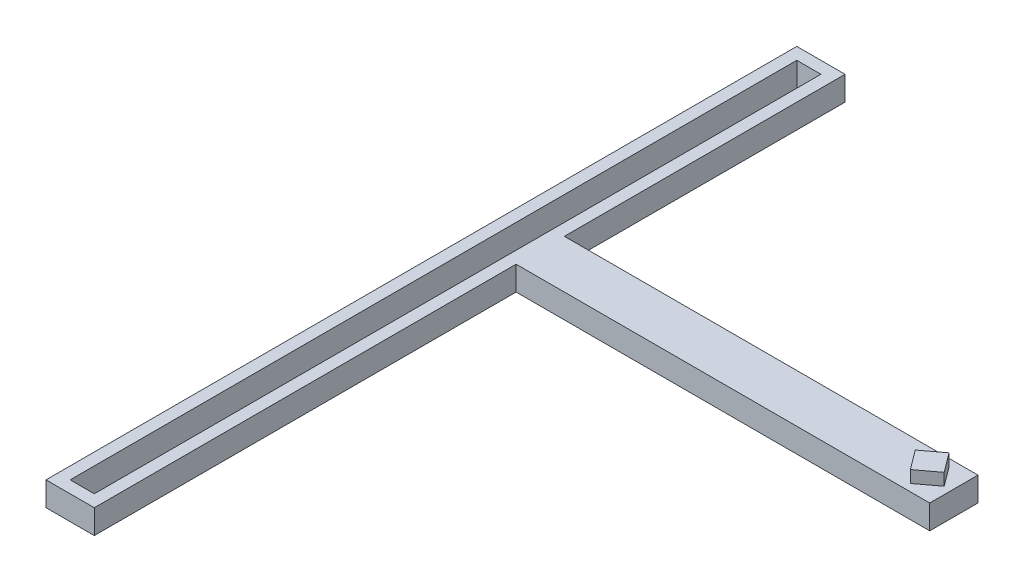
ISO-10303-21;
HEADER;
FILE_DESCRIPTION(('STEP AP214'),'2;1');
FILE_NAME('part.step','',(''),(''),'','','');
FILE_SCHEMA(('AUTOMOTIVE_DESIGN { 1 0 10303 214 1 1 1 1 }'));
ENDSEC;
DATA;
#1=APPLICATION_CONTEXT('core data for automotive mechanical design processes');
#2=APPLICATION_PROTOCOL_DEFINITION('international standard','automotive_design',2000,#1);
#3=PRODUCT_CONTEXT('',#1,'mechanical');
#4=PRODUCT('Part','Part','',(#3));
#5=PRODUCT_RELATED_PRODUCT_CATEGORY('part','',(#4));
#6=PRODUCT_DEFINITION_FORMATION('','',#4);
#7=PRODUCT_DEFINITION_CONTEXT('part definition',#1,'design');
#8=PRODUCT_DEFINITION('design','',#6,#7);
#9=PRODUCT_DEFINITION_SHAPE('','',#8);
#10=(LENGTH_UNIT() NAMED_UNIT(*) SI_UNIT(.MILLI.,.METRE.));
#11=(NAMED_UNIT(*) PLANE_ANGLE_UNIT() SI_UNIT($,.RADIAN.));
#12=(NAMED_UNIT(*) SI_UNIT($,.STERADIAN.) SOLID_ANGLE_UNIT());
#13=UNCERTAINTY_MEASURE_WITH_UNIT(LENGTH_MEASURE(1.E-05),#10,'distance_accuracy_value','');
#14=(GEOMETRIC_REPRESENTATION_CONTEXT(3) GLOBAL_UNCERTAINTY_ASSIGNED_CONTEXT((#13)) GLOBAL_UNIT_ASSIGNED_CONTEXT((#10,
#11,#12)) REPRESENTATION_CONTEXT('',''));
#15=CARTESIAN_POINT('',(0.,0.,0.));
#16=DIRECTION('',(0.,0.,1.));
#17=DIRECTION('',(1.,0.,0.));
#18=AXIS2_PLACEMENT_3D('',#15,#16,#17);
#19=CARTESIAN_POINT('',(0.,-4.,0.));
#20=DIRECTION('',(0.,-1.,0.));
#21=DIRECTION('',(0.,0.,-1.));
#22=AXIS2_PLACEMENT_3D('',#19,#20,#21);
#23=PLANE('',#22);
#24=DIRECTION('',(1.,0.,0.));
#25=VECTOR('',#24,1.);
#26=CARTESIAN_POINT('',(0.,-4.,-60.3815572471546));
#27=LINE('',#26,#25);
#28=CARTESIAN_POINT('',(-4.,-4.,-60.3815572471546));
#29=VERTEX_POINT('',#28);
#30=CARTESIAN_POINT('',(4.,-4.,-60.3815572471546));
#31=VERTEX_POINT('',#30);
#32=EDGE_CURVE('E231',#29,#31,#27,.T.);
#33=ORIENTED_EDGE('',*,*,#32,.F.);
#34=DIRECTION('',(0.,0.,-1.));
#35=VECTOR('',#34,1.);
#36=CARTESIAN_POINT('',(-4.,-4.,0.));
#37=LINE('',#36,#35);
#38=CARTESIAN_POINT('',(-4.,-4.,64.));
#39=VERTEX_POINT('',#38);
#40=EDGE_CURVE('E193',#39,#29,#37,.T.);
#41=ORIENTED_EDGE('',*,*,#40,.F.);
#42=DIRECTION('',(1.,0.,0.));
#43=VECTOR('',#42,1.);
#44=CARTESIAN_POINT('',(0.,-4.,64.));
#45=LINE('',#44,#43);
#46=CARTESIAN_POINT('',(4.,-4.,64.));
#47=VERTEX_POINT('',#46);
#48=EDGE_CURVE('E247',#39,#47,#45,.T.);
#49=ORIENTED_EDGE('',*,*,#48,.T.);
#50=DIRECTION('',(0.,0.,-1.));
#51=VECTOR('',#50,1.);
#52=CARTESIAN_POINT('',(4.00000000000001,-4.,0.));
#53=LINE('',#52,#51);
#54=CARTESIAN_POINT('',(4.00000000000001,-4.,-5.88155724715465));
#55=VERTEX_POINT('',#54);
#56=EDGE_CURVE('E238',#47,#55,#53,.T.);
#57=ORIENTED_EDGE('',*,*,#56,.T.);
#58=DIRECTION('',(1.,0.,0.));
#59=VECTOR('',#58,1.);
#60=CARTESIAN_POINT('',(0.,-4.,-5.88155724715465));
#61=LINE('',#60,#59);
#62=CARTESIAN_POINT('',(72.5212085995398,-4.,-5.88155724715465));
#63=VERTEX_POINT('',#62);
#64=EDGE_CURVE('E244',#55,#63,#61,.T.);
#65=ORIENTED_EDGE('',*,*,#64,.T.);
#66=DIRECTION('',(0.,0.,-1.));
#67=VECTOR('',#66,1.);
#68=CARTESIAN_POINT('',(72.5212085995398,-4.,0.));
#69=LINE('',#68,#67);
#70=CARTESIAN_POINT('',(72.5212085995398,-4.,-13.8815572471547));
#71=VERTEX_POINT('',#70);
#72=EDGE_CURVE('E241',#63,#71,#69,.T.);
#73=ORIENTED_EDGE('',*,*,#72,.T.);
#74=DIRECTION('',(-1.,0.,0.));
#75=VECTOR('',#74,1.);
#76=CARTESIAN_POINT('',(0.,-4.,-13.8815572471547));
#77=LINE('',#76,#75);
#78=CARTESIAN_POINT('',(4.00000000000001,-4.,-13.8815572471547));
#79=VERTEX_POINT('',#78);
#80=EDGE_CURVE('E237',#71,#79,#77,.T.);
#81=ORIENTED_EDGE('',*,*,#80,.T.);
#82=EDGE_CURVE('E234',#79,#31,#53,.T.);
#83=ORIENTED_EDGE('',*,*,#82,.T.);
#84=EDGE_LOOP('',(#33,#41,#49,#57,#65,#73,#81,#83));
#85=FACE_BOUND('',#84,.T.);
#86=DIRECTION('',(0.,0.,-1.));
#87=VECTOR('',#86,1.);
#88=CARTESIAN_POINT('',(2.00000000000001,-4.,0.));
#89=LINE('',#88,#87);
#90=CARTESIAN_POINT('',(2.,-4.,62.));
#91=VERTEX_POINT('',#90);
#92=CARTESIAN_POINT('',(2.,-4.,-58.3815572471546));
#93=VERTEX_POINT('',#92);
#94=EDGE_CURVE('E185',#91,#93,#89,.T.);
#95=ORIENTED_EDGE('',*,*,#94,.F.);
#96=DIRECTION('',(1.,0.,0.));
#97=VECTOR('',#96,1.);
#98=CARTESIAN_POINT('',(0.,-4.,62.));
#99=LINE('',#98,#97);
#100=CARTESIAN_POINT('',(-2.,-4.,62.));
#101=VERTEX_POINT('',#100);
#102=EDGE_CURVE('E229',#101,#91,#99,.T.);
#103=ORIENTED_EDGE('',*,*,#102,.F.);
#104=DIRECTION('',(0.,0.,-1.));
#105=VECTOR('',#104,1.);
#106=CARTESIAN_POINT('',(-2.,-4.,0.));
#107=LINE('',#106,#105);
#108=CARTESIAN_POINT('',(-2.,-4.,-58.3815572471546));
#109=VERTEX_POINT('',#108);
#110=EDGE_CURVE('E226',#101,#109,#107,.T.);
#111=ORIENTED_EDGE('',*,*,#110,.T.);
#112=DIRECTION('',(-1.,0.,0.));
#113=VECTOR('',#112,1.);
#114=CARTESIAN_POINT('',(0.,-4.,-58.3815572471546));
#115=LINE('',#114,#113);
#116=EDGE_CURVE('E223',#93,#109,#115,.T.);
#117=ORIENTED_EDGE('',*,*,#116,.F.);
#118=EDGE_LOOP('',(#95,#103,#111,#117));
#119=FACE_BOUND('',#118,.T.);
#120=DIRECTION('',(0.800000000000001,0.,-0.599999999999999));
#121=VECTOR('',#120,1.);
#122=CARTESIAN_POINT('',(21.1244876172,-4.,28.1659834896001));
#123=LINE('',#122,#121);
#124=CARTESIAN_POINT('',(68.1212085995397,-4.,-7.08155724715465));
#125=VERTEX_POINT('',#124);
#126=CARTESIAN_POINT('',(71.3212085995397,-4.,-9.48155724715465));
#127=VERTEX_POINT('',#126);
#128=EDGE_CURVE('E180',#125,#127,#123,.T.);
#129=ORIENTED_EDGE('',*,*,#128,.F.);
#130=DIRECTION('',(0.599999999999999,0.,0.800000000000001));
#131=VECTOR('',#130,1.);
#132=CARTESIAN_POINT('',(46.9967209823397,-4.,-35.2475407367547));
#133=LINE('',#132,#131);
#134=CARTESIAN_POINT('',(65.7212085995397,-4.,-10.2815572471546));
#135=VERTEX_POINT('',#134);
#136=EDGE_CURVE('E166',#135,#125,#133,.T.);
#137=ORIENTED_EDGE('',*,*,#136,.F.);
#138=DIRECTION('',(0.800000000000001,0.,-0.599999999999998));
#139=VECTOR('',#138,1.);
#140=CARTESIAN_POINT('',(18.7244876171999,-4.,24.9659834896));
#141=LINE('',#140,#139);
#142=CARTESIAN_POINT('',(68.9212085995398,-4.,-12.6815572471547));
#143=VERTEX_POINT('',#142);
#144=EDGE_CURVE('E59',#135,#143,#141,.T.);
#145=ORIENTED_EDGE('',*,*,#144,.T.);
#146=DIRECTION('',(0.6,0.,0.8));
#147=VECTOR('',#146,1.);
#148=CARTESIAN_POINT('',(50.1967209823397,-4.,-37.6475407367548));
#149=LINE('',#148,#147);
#150=EDGE_CURVE('E54',#143,#127,#149,.T.);
#151=ORIENTED_EDGE('',*,*,#150,.T.);
#152=EDGE_LOOP('',(#129,#137,#145,#151));
#153=FACE_BOUND('',#152,.T.);
#154=ADVANCED_FACE('F37',(#85,#119,#153),#23,.F.);
#155=CARTESIAN_POINT('',(0.,-8.,-60.3815572471546));
#156=DIRECTION('',(0.,0.,1.));
#157=DIRECTION('',(1.,0.,0.));
#158=AXIS2_PLACEMENT_3D('',#155,#156,#157);
#159=PLANE('',#158);
#160=ORIENTED_EDGE('',*,*,#32,.T.);
#161=DIRECTION('',(0.,1.,0.));
#162=VECTOR('',#161,1.);
#163=CARTESIAN_POINT('',(4.,-8.,-60.3815572471546));
#164=LINE('',#163,#162);
#165=CARTESIAN_POINT('',(4.,-8.,-60.3815572471546));
#166=VERTEX_POINT('',#165);
#167=EDGE_CURVE('E12',#166,#31,#164,.T.);
#168=ORIENTED_EDGE('',*,*,#167,.F.);
#169=DIRECTION('',(1.,0.,0.));
#170=VECTOR('',#169,1.);
#171=CARTESIAN_POINT('',(0.,-8.,-60.3815572471546));
#172=LINE('',#171,#170);
#173=CARTESIAN_POINT('',(-4.,-8.,-60.3815572471546));
#174=VERTEX_POINT('',#173);
#175=EDGE_CURVE('E200',#174,#166,#172,.T.);
#176=ORIENTED_EDGE('',*,*,#175,.F.);
#177=DIRECTION('',(0.,1.,0.));
#178=VECTOR('',#177,1.);
#179=CARTESIAN_POINT('',(-4.,-8.,-60.3815572471546));
#180=LINE('',#179,#178);
#181=EDGE_CURVE('E251',#174,#29,#180,.T.);
#182=ORIENTED_EDGE('',*,*,#181,.T.);
#183=EDGE_LOOP('',(#160,#168,#176,#182));
#184=FACE_BOUND('',#183,.T.);
#185=ADVANCED_FACE('F301',(#184),#159,.F.);
#186=CARTESIAN_POINT('',(4.00000000000001,-8.,0.));
#187=DIRECTION('',(1.,0.,0.));
#188=DIRECTION('',(0.,0.,-1.));
#189=AXIS2_PLACEMENT_3D('',#186,#187,#188);
#190=PLANE('',#189);
#191=ORIENTED_EDGE('',*,*,#82,.F.);
#192=DIRECTION('',(0.,1.,0.));
#193=VECTOR('',#192,1.);
#194=CARTESIAN_POINT('',(4.00000000000001,-8.,-13.8815572471547));
#195=LINE('',#194,#193);
#196=CARTESIAN_POINT('',(4.00000000000001,-8.,-13.8815572471547));
#197=VERTEX_POINT('',#196);
#198=EDGE_CURVE('E46',#197,#79,#195,.T.);
#199=ORIENTED_EDGE('',*,*,#198,.F.);
#200=DIRECTION('',(0.,0.,-1.));
#201=VECTOR('',#200,1.);
#202=CARTESIAN_POINT('',(4.00000000000001,-8.,0.));
#203=LINE('',#202,#201);
#204=EDGE_CURVE('E202',#197,#166,#203,.T.);
#205=ORIENTED_EDGE('',*,*,#204,.T.);
#206=ORIENTED_EDGE('',*,*,#167,.T.);
#207=EDGE_LOOP('',(#191,#199,#205,#206));
#208=FACE_BOUND('',#207,.T.);
#209=ADVANCED_FACE('F305',(#208),#190,.T.);
#210=CARTESIAN_POINT('',(0.,-8.,-13.8815572471547));
#211=DIRECTION('',(0.,0.,-1.));
#212=DIRECTION('',(-1.,0.,0.));
#213=AXIS2_PLACEMENT_3D('',#210,#211,#212);
#214=PLANE('',#213);
#215=ORIENTED_EDGE('',*,*,#80,.F.);
#216=DIRECTION('',(0.,1.,0.));
#217=VECTOR('',#216,1.);
#218=CARTESIAN_POINT('',(72.5212085995398,-8.,-13.8815572471547));
#219=LINE('',#218,#217);
#220=CARTESIAN_POINT('',(72.5212085995398,-8.,-13.8815572471547));
#221=VERTEX_POINT('',#220);
#222=EDGE_CURVE('E262',#221,#71,#219,.T.);
#223=ORIENTED_EDGE('',*,*,#222,.F.);
#224=DIRECTION('',(-1.,0.,0.));
#225=VECTOR('',#224,1.);
#226=CARTESIAN_POINT('',(0.,-8.,-13.8815572471547));
#227=LINE('',#226,#225);
#228=EDGE_CURVE('E205',#221,#197,#227,.T.);
#229=ORIENTED_EDGE('',*,*,#228,.T.);
#230=ORIENTED_EDGE('',*,*,#198,.T.);
#231=EDGE_LOOP('',(#215,#223,#229,#230));
#232=FACE_BOUND('',#231,.T.);
#233=ADVANCED_FACE('F308',(#232),#214,.T.);
#234=CARTESIAN_POINT('',(72.5212085995398,-8.,0.));
#235=DIRECTION('',(1.,0.,0.));
#236=DIRECTION('',(0.,0.,-1.));
#237=AXIS2_PLACEMENT_3D('',#234,#235,#236);
#238=PLANE('',#237);
#239=ORIENTED_EDGE('',*,*,#72,.F.);
#240=DIRECTION('',(0.,1.,0.));
#241=VECTOR('',#240,1.);
#242=CARTESIAN_POINT('',(72.5212085995398,-8.,-5.88155724715465));
#243=LINE('',#242,#241);
#244=CARTESIAN_POINT('',(72.5212085995398,-8.,-5.88155724715465));
#245=VERTEX_POINT('',#244);
#246=EDGE_CURVE('E260',#245,#63,#243,.T.);
#247=ORIENTED_EDGE('',*,*,#246,.F.);
#248=DIRECTION('',(0.,0.,-1.));
#249=VECTOR('',#248,1.);
#250=CARTESIAN_POINT('',(72.5212085995398,-8.,0.));
#251=LINE('',#250,#249);
#252=EDGE_CURVE('E209',#245,#221,#251,.T.);
#253=ORIENTED_EDGE('',*,*,#252,.T.);
#254=ORIENTED_EDGE('',*,*,#222,.T.);
#255=EDGE_LOOP('',(#239,#247,#253,#254));
#256=FACE_BOUND('',#255,.T.);
#257=ADVANCED_FACE('F313',(#256),#238,.T.);
#258=CARTESIAN_POINT('',(0.,-8.,-5.88155724715465));
#259=DIRECTION('',(0.,0.,1.));
#260=DIRECTION('',(1.,0.,0.));
#261=AXIS2_PLACEMENT_3D('',#258,#259,#260);
#262=PLANE('',#261);
#263=ORIENTED_EDGE('',*,*,#64,.F.);
#264=DIRECTION('',(0.,1.,0.));
#265=VECTOR('',#264,1.);
#266=CARTESIAN_POINT('',(4.00000000000001,-8.,-5.88155724715465));
#267=LINE('',#266,#265);
#268=CARTESIAN_POINT('',(4.00000000000001,-8.,-5.88155724715465));
#269=VERTEX_POINT('',#268);
#270=EDGE_CURVE('E258',#269,#55,#267,.T.);
#271=ORIENTED_EDGE('',*,*,#270,.F.);
#272=DIRECTION('',(1.,0.,0.));
#273=VECTOR('',#272,1.);
#274=CARTESIAN_POINT('',(0.,-8.,-5.88155724715465));
#275=LINE('',#274,#273);
#276=EDGE_CURVE('E212',#269,#245,#275,.T.);
#277=ORIENTED_EDGE('',*,*,#276,.T.);
#278=ORIENTED_EDGE('',*,*,#246,.T.);
#279=EDGE_LOOP('',(#263,#271,#277,#278));
#280=FACE_BOUND('',#279,.T.);
#281=ADVANCED_FACE('F316',(#280),#262,.T.);
#282=ORIENTED_EDGE('',*,*,#56,.F.);
#283=DIRECTION('',(0.,1.,0.));
#284=VECTOR('',#283,1.);
#285=CARTESIAN_POINT('',(4.,-8.,64.));
#286=LINE('',#285,#284);
#287=CARTESIAN_POINT('',(4.,-8.,64.));
#288=VERTEX_POINT('',#287);
#289=EDGE_CURVE('E256',#288,#47,#286,.T.);
#290=ORIENTED_EDGE('',*,*,#289,.F.);
#291=EDGE_CURVE('E206',#288,#269,#203,.T.);
#292=ORIENTED_EDGE('',*,*,#291,.T.);
#293=ORIENTED_EDGE('',*,*,#270,.T.);
#294=EDGE_LOOP('',(#282,#290,#292,#293));
#295=FACE_BOUND('',#294,.T.);
#296=ADVANCED_FACE('F322',(#295),#190,.T.);
#297=CARTESIAN_POINT('',(0.,-8.,64.));
#298=DIRECTION('',(0.,0.,1.));
#299=DIRECTION('',(1.,0.,0.));
#300=AXIS2_PLACEMENT_3D('',#297,#298,#299);
#301=PLANE('',#300);
#302=ORIENTED_EDGE('',*,*,#48,.F.);
#303=DIRECTION('',(0.,1.,0.));
#304=VECTOR('',#303,1.);
#305=CARTESIAN_POINT('',(-4.,-8.,64.));
#306=LINE('',#305,#304);
#307=CARTESIAN_POINT('',(-4.,-8.,64.));
#308=VERTEX_POINT('',#307);
#309=EDGE_CURVE('E254',#308,#39,#306,.T.);
#310=ORIENTED_EDGE('',*,*,#309,.F.);
#311=DIRECTION('',(1.,0.,0.));
#312=VECTOR('',#311,1.);
#313=CARTESIAN_POINT('',(0.,-8.,64.));
#314=LINE('',#313,#312);
#315=EDGE_CURVE('E215',#308,#288,#314,.T.);
#316=ORIENTED_EDGE('',*,*,#315,.T.);
#317=ORIENTED_EDGE('',*,*,#289,.T.);
#318=EDGE_LOOP('',(#302,#310,#316,#317));
#319=FACE_BOUND('',#318,.T.);
#320=ADVANCED_FACE('F325',(#319),#301,.T.);
#321=CARTESIAN_POINT('',(2.00000000000001,-8.,0.));
#322=DIRECTION('',(1.,0.,0.));
#323=DIRECTION('',(0.,0.,-1.));
#324=AXIS2_PLACEMENT_3D('',#321,#322,#323);
#325=PLANE('',#324);
#326=ORIENTED_EDGE('',*,*,#94,.T.);
#327=DIRECTION('',(0.,1.,0.));
#328=VECTOR('',#327,1.);
#329=CARTESIAN_POINT('',(2.,-8.,-58.3815572471546));
#330=LINE('',#329,#328);
#331=CARTESIAN_POINT('',(2.,-8.,-58.3815572471546));
#332=VERTEX_POINT('',#331);
#333=EDGE_CURVE('E41',#332,#93,#330,.T.);
#334=ORIENTED_EDGE('',*,*,#333,.F.);
#335=DIRECTION('',(0.,0.,-1.));
#336=VECTOR('',#335,1.);
#337=CARTESIAN_POINT('',(2.00000000000001,-8.,0.));
#338=LINE('',#337,#336);
#339=CARTESIAN_POINT('',(2.,-8.,62.));
#340=VERTEX_POINT('',#339);
#341=EDGE_CURVE('E189',#340,#332,#338,.T.);
#342=ORIENTED_EDGE('',*,*,#341,.F.);
#343=DIRECTION('',(0.,1.,0.));
#344=VECTOR('',#343,1.);
#345=CARTESIAN_POINT('',(2.,-8.,62.));
#346=LINE('',#345,#344);
#347=EDGE_CURVE('E220',#340,#91,#346,.T.);
#348=ORIENTED_EDGE('',*,*,#347,.T.);
#349=EDGE_LOOP('',(#326,#334,#342,#348));
#350=FACE_BOUND('',#349,.T.);
#351=ADVANCED_FACE('F39',(#350),#325,.F.);
#352=CARTESIAN_POINT('',(0.,-8.,-58.3815572471546));
#353=DIRECTION('',(0.,0.,-1.));
#354=DIRECTION('',(-1.,0.,0.));
#355=AXIS2_PLACEMENT_3D('',#352,#353,#354);
#356=PLANE('',#355);
#357=ORIENTED_EDGE('',*,*,#116,.T.);
#358=DIRECTION('',(0.,1.,0.));
#359=VECTOR('',#358,1.);
#360=CARTESIAN_POINT('',(-2.,-8.,-58.3815572471546));
#361=LINE('',#360,#359);
#362=CARTESIAN_POINT('',(-2.,-8.,-58.3815572471546));
#363=VERTEX_POINT('',#362);
#364=EDGE_CURVE('E268',#363,#109,#361,.T.);
#365=ORIENTED_EDGE('',*,*,#364,.F.);
#366=DIRECTION('',(-1.,0.,0.));
#367=VECTOR('',#366,1.);
#368=CARTESIAN_POINT('',(0.,-8.,-58.3815572471546));
#369=LINE('',#368,#367);
#370=EDGE_CURVE('E192',#332,#363,#369,.T.);
#371=ORIENTED_EDGE('',*,*,#370,.F.);
#372=ORIENTED_EDGE('',*,*,#333,.T.);
#373=EDGE_LOOP('',(#357,#365,#371,#372));
#374=FACE_BOUND('',#373,.T.);
#375=ADVANCED_FACE('F275',(#374),#356,.F.);
#376=CARTESIAN_POINT('',(-2.,-8.,0.));
#377=DIRECTION('',(1.,0.,0.));
#378=DIRECTION('',(0.,0.,-1.));
#379=AXIS2_PLACEMENT_3D('',#376,#377,#378);
#380=PLANE('',#379);
#381=ORIENTED_EDGE('',*,*,#110,.F.);
#382=DIRECTION('',(0.,1.,0.));
#383=VECTOR('',#382,1.);
#384=CARTESIAN_POINT('',(-2.,-8.,62.));
#385=LINE('',#384,#383);
#386=CARTESIAN_POINT('',(-2.,-8.,62.));
#387=VERTEX_POINT('',#386);
#388=EDGE_CURVE('E267',#387,#101,#385,.T.);
#389=ORIENTED_EDGE('',*,*,#388,.F.);
#390=DIRECTION('',(0.,0.,-1.));
#391=VECTOR('',#390,1.);
#392=CARTESIAN_POINT('',(-2.,-8.,0.));
#393=LINE('',#392,#391);
#394=EDGE_CURVE('E195',#387,#363,#393,.T.);
#395=ORIENTED_EDGE('',*,*,#394,.T.);
#396=ORIENTED_EDGE('',*,*,#364,.T.);
#397=EDGE_LOOP('',(#381,#389,#395,#396));
#398=FACE_BOUND('',#397,.T.);
#399=ADVANCED_FACE('F282',(#398),#380,.T.);
#400=CARTESIAN_POINT('',(0.,-8.,62.));
#401=DIRECTION('',(0.,0.,1.));
#402=DIRECTION('',(1.,0.,0.));
#403=AXIS2_PLACEMENT_3D('',#400,#401,#402);
#404=PLANE('',#403);
#405=ORIENTED_EDGE('',*,*,#102,.T.);
#406=ORIENTED_EDGE('',*,*,#347,.F.);
#407=DIRECTION('',(1.,0.,0.));
#408=VECTOR('',#407,1.);
#409=CARTESIAN_POINT('',(0.,-8.,62.));
#410=LINE('',#409,#408);
#411=EDGE_CURVE('E198',#387,#340,#410,.T.);
#412=ORIENTED_EDGE('',*,*,#411,.F.);
#413=ORIENTED_EDGE('',*,*,#388,.T.);
#414=EDGE_LOOP('',(#405,#406,#412,#413));
#415=FACE_BOUND('',#414,.T.);
#416=ADVANCED_FACE('F286',(#415),#404,.F.);
#417=CARTESIAN_POINT('',(-4.,-8.,0.));
#418=DIRECTION('',(1.,0.,0.));
#419=DIRECTION('',(0.,0.,-1.));
#420=AXIS2_PLACEMENT_3D('',#417,#418,#419);
#421=PLANE('',#420);
#422=ORIENTED_EDGE('',*,*,#40,.T.);
#423=ORIENTED_EDGE('',*,*,#181,.F.);
#424=DIRECTION('',(0.,0.,-1.));
#425=VECTOR('',#424,1.);
#426=CARTESIAN_POINT('',(-4.,-8.,0.));
#427=LINE('',#426,#425);
#428=EDGE_CURVE('E218',#308,#174,#427,.T.);
#429=ORIENTED_EDGE('',*,*,#428,.F.);
#430=ORIENTED_EDGE('',*,*,#309,.T.);
#431=EDGE_LOOP('',(#422,#423,#429,#430));
#432=FACE_BOUND('',#431,.T.);
#433=ADVANCED_FACE('F291',(#432),#421,.F.);
#434=CARTESIAN_POINT('',(0.,-8.,0.));
#435=DIRECTION('',(0.,-1.,0.));
#436=DIRECTION('',(0.,0.,-1.));
#437=AXIS2_PLACEMENT_3D('',#434,#435,#436);
#438=PLANE('',#437);
#439=ORIENTED_EDGE('',*,*,#341,.T.);
#440=ORIENTED_EDGE('',*,*,#370,.T.);
#441=ORIENTED_EDGE('',*,*,#394,.F.);
#442=ORIENTED_EDGE('',*,*,#411,.T.);
#443=EDGE_LOOP('',(#439,#440,#441,#442));
#444=FACE_BOUND('',#443,.T.);
#445=ORIENTED_EDGE('',*,*,#175,.T.);
#446=ORIENTED_EDGE('',*,*,#204,.F.);
#447=ORIENTED_EDGE('',*,*,#228,.F.);
#448=ORIENTED_EDGE('',*,*,#252,.F.);
#449=ORIENTED_EDGE('',*,*,#276,.F.);
#450=ORIENTED_EDGE('',*,*,#291,.F.);
#451=ORIENTED_EDGE('',*,*,#315,.F.);
#452=ORIENTED_EDGE('',*,*,#428,.T.);
#453=EDGE_LOOP('',(#445,#446,#447,#448,#449,#450,#451,#452));
#454=FACE_BOUND('',#453,.T.);
#455=ADVANCED_FACE('F288',(#444,#454),#438,.T.);
#456=CARTESIAN_POINT('',(21.1244876172,-2.,28.1659834896001));
#457=DIRECTION('',(-0.599999999999999,0.,-0.800000000000001));
#458=DIRECTION('',(-0.800000000000001,0.,0.599999999999999));
#459=AXIS2_PLACEMENT_3D('',#456,#457,#458);
#460=PLANE('',#459);
#461=ORIENTED_EDGE('',*,*,#128,.T.);
#462=DIRECTION('',(0.,-1.,0.));
#463=VECTOR('',#462,1.);
#464=CARTESIAN_POINT('',(71.3212085995397,-2.,-9.48155724715465));
#465=LINE('',#464,#463);
#466=CARTESIAN_POINT('',(71.3212085995397,-2.,-9.48155724715465));
#467=VERTEX_POINT('',#466);
#468=EDGE_CURVE('E173',#467,#127,#465,.T.);
#469=ORIENTED_EDGE('',*,*,#468,.F.);
#470=DIRECTION('',(0.800000000000001,0.,-0.599999999999999));
#471=VECTOR('',#470,1.);
#472=CARTESIAN_POINT('',(21.1244876172,-2.,28.1659834896001));
#473=LINE('',#472,#471);
#474=CARTESIAN_POINT('',(68.1212085995397,-2.,-7.08155724715465));
#475=VERTEX_POINT('',#474);
#476=EDGE_CURVE('E155',#475,#467,#473,.T.);
#477=ORIENTED_EDGE('',*,*,#476,.F.);
#478=DIRECTION('',(0.,-1.,0.));
#479=VECTOR('',#478,1.);
#480=CARTESIAN_POINT('',(68.1212085995397,-2.,-7.08155724715465));
#481=LINE('',#480,#479);
#482=EDGE_CURVE('E164',#475,#125,#481,.T.);
#483=ORIENTED_EDGE('',*,*,#482,.T.);
#484=EDGE_LOOP('',(#461,#469,#477,#483));
#485=FACE_BOUND('',#484,.T.);
#486=ADVANCED_FACE('F172',(#485),#460,.F.);
#487=CARTESIAN_POINT('',(50.1967209823397,-2.,-37.6475407367548));
#488=DIRECTION('',(0.8,0.,-0.6));
#489=DIRECTION('',(-0.6,0.,-0.8));
#490=AXIS2_PLACEMENT_3D('',#487,#488,#489);
#491=PLANE('',#490);
#492=ORIENTED_EDGE('',*,*,#150,.F.);
#493=DIRECTION('',(0.,-1.,0.));
#494=VECTOR('',#493,1.);
#495=CARTESIAN_POINT('',(68.9212085995398,-2.,-12.6815572471547));
#496=LINE('',#495,#494);
#497=CARTESIAN_POINT('',(68.9212085995398,-2.,-12.6815572471547));
#498=VERTEX_POINT('',#497);
#499=EDGE_CURVE('E186',#498,#143,#496,.T.);
#500=ORIENTED_EDGE('',*,*,#499,.F.);
#501=DIRECTION('',(0.6,0.,0.8));
#502=VECTOR('',#501,1.);
#503=CARTESIAN_POINT('',(50.1967209823397,-2.,-37.6475407367548));
#504=LINE('',#503,#502);
#505=EDGE_CURVE('E170',#498,#467,#504,.T.);
#506=ORIENTED_EDGE('',*,*,#505,.T.);
#507=ORIENTED_EDGE('',*,*,#468,.T.);
#508=EDGE_LOOP('',(#492,#500,#506,#507));
#509=FACE_BOUND('',#508,.T.);
#510=ADVANCED_FACE('F421',(#509),#491,.T.);
#511=CARTESIAN_POINT('',(18.7244876171999,-2.,24.9659834896));
#512=DIRECTION('',(-0.599999999999998,0.,-0.800000000000002));
#513=DIRECTION('',(-0.800000000000002,0.,0.599999999999998));
#514=AXIS2_PLACEMENT_3D('',#511,#512,#513);
#515=PLANE('',#514);
#516=ORIENTED_EDGE('',*,*,#144,.F.);
#517=DIRECTION('',(0.,-1.,0.));
#518=VECTOR('',#517,1.);
#519=CARTESIAN_POINT('',(65.7212085995397,-2.,-10.2815572471546));
#520=LINE('',#519,#518);
#521=CARTESIAN_POINT('',(65.7212085995397,-2.,-10.2815572471546));
#522=VERTEX_POINT('',#521);
#523=EDGE_CURVE('E169',#522,#135,#520,.T.);
#524=ORIENTED_EDGE('',*,*,#523,.F.);
#525=DIRECTION('',(0.800000000000001,0.,-0.599999999999998));
#526=VECTOR('',#525,1.);
#527=CARTESIAN_POINT('',(18.7244876171999,-2.,24.9659834896));
#528=LINE('',#527,#526);
#529=EDGE_CURVE('E158',#522,#498,#528,.T.);
#530=ORIENTED_EDGE('',*,*,#529,.T.);
#531=ORIENTED_EDGE('',*,*,#499,.T.);
#532=EDGE_LOOP('',(#516,#524,#530,#531));
#533=FACE_BOUND('',#532,.T.);
#534=ADVANCED_FACE('F426',(#533),#515,.T.);
#535=CARTESIAN_POINT('',(46.9967209823397,-2.,-35.2475407367547));
#536=DIRECTION('',(0.800000000000001,0.,-0.599999999999999));
#537=DIRECTION('',(-0.599999999999999,0.,-0.800000000000001));
#538=AXIS2_PLACEMENT_3D('',#535,#536,#537);
#539=PLANE('',#538);
#540=ORIENTED_EDGE('',*,*,#136,.T.);
#541=ORIENTED_EDGE('',*,*,#482,.F.);
#542=DIRECTION('',(0.599999999999999,0.,0.800000000000001));
#543=VECTOR('',#542,1.);
#544=CARTESIAN_POINT('',(46.9967209823397,-2.,-35.2475407367547));
#545=LINE('',#544,#543);
#546=EDGE_CURVE('E150',#522,#475,#545,.T.);
#547=ORIENTED_EDGE('',*,*,#546,.F.);
#548=ORIENTED_EDGE('',*,*,#523,.T.);
#549=EDGE_LOOP('',(#540,#541,#547,#548));
#550=FACE_BOUND('',#549,.T.);
#551=ADVANCED_FACE('F165',(#550),#539,.F.);
#552=CARTESIAN_POINT('',(0.,-2.,0.));
#553=DIRECTION('',(0.,-1.,0.));
#554=DIRECTION('',(0.,0.,-1.));
#555=AXIS2_PLACEMENT_3D('',#552,#553,#554);
#556=PLANE('',#555);
#557=ORIENTED_EDGE('',*,*,#476,.T.);
#558=ORIENTED_EDGE('',*,*,#505,.F.);
#559=ORIENTED_EDGE('',*,*,#529,.F.);
#560=ORIENTED_EDGE('',*,*,#546,.T.);
#561=EDGE_LOOP('',(#557,#558,#559,#560));
#562=FACE_BOUND('',#561,.T.);
#563=ADVANCED_FACE('F152',(#562),#556,.F.);
#564=CLOSED_SHELL('',(#154,#185,#209,#233,#257,#281,#296,#320,#351,#375,#399,#416,#433,#455,
#486,#510,#534,#551,#563));
#565=MANIFOLD_SOLID_BREP('B2',#564);
#566=ADVANCED_BREP_SHAPE_REPRESENTATION('',(#18,#565),#14);
#567=SHAPE_DEFINITION_REPRESENTATION(#9,#566);
ENDSEC;
END-ISO-10303-21;
